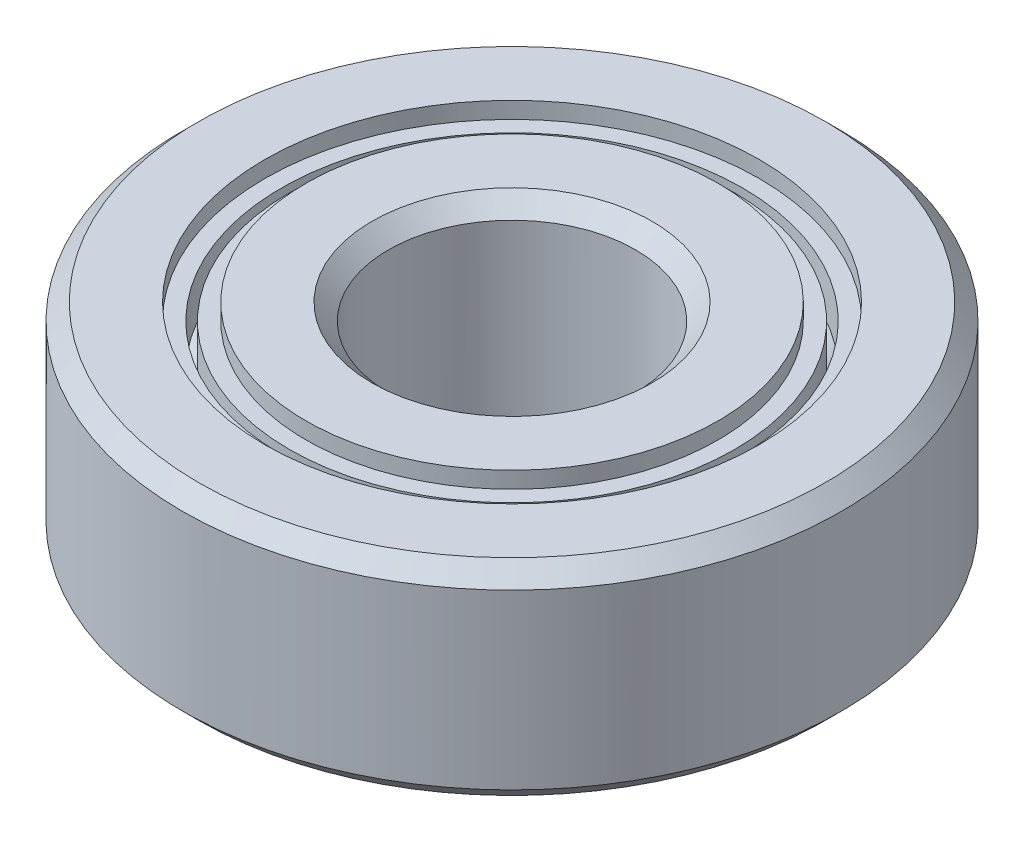
ISO-10303-21;
HEADER;
FILE_DESCRIPTION(('STEP AP214'),'2;1');
FILE_NAME('part.step','',(''),(''),'','','');
FILE_SCHEMA(('AUTOMOTIVE_DESIGN { 1 0 10303 214 1 1 1 1 }'));
ENDSEC;
DATA;
#1=APPLICATION_CONTEXT('core data for automotive mechanical design processes');
#2=APPLICATION_PROTOCOL_DEFINITION('international standard','automotive_design',2000,#1);
#3=PRODUCT_CONTEXT('',#1,'mechanical');
#4=PRODUCT('Part','Part','',(#3));
#5=PRODUCT_RELATED_PRODUCT_CATEGORY('part','',(#4));
#6=PRODUCT_DEFINITION_FORMATION('','',#4);
#7=PRODUCT_DEFINITION_CONTEXT('part definition',#1,'design');
#8=PRODUCT_DEFINITION('design','',#6,#7);
#9=PRODUCT_DEFINITION_SHAPE('','',#8);
#10=(LENGTH_UNIT() NAMED_UNIT(*) SI_UNIT(.MILLI.,.METRE.));
#11=(NAMED_UNIT(*) PLANE_ANGLE_UNIT() SI_UNIT($,.RADIAN.));
#12=(NAMED_UNIT(*) SI_UNIT($,.STERADIAN.) SOLID_ANGLE_UNIT());
#13=UNCERTAINTY_MEASURE_WITH_UNIT(LENGTH_MEASURE(1.E-05),#10,'distance_accuracy_value','');
#14=(GEOMETRIC_REPRESENTATION_CONTEXT(3) GLOBAL_UNCERTAINTY_ASSIGNED_CONTEXT((#13)) GLOBAL_UNIT_ASSIGNED_CONTEXT((#10,
#11,#12)) REPRESENTATION_CONTEXT('',''));
#15=CARTESIAN_POINT('',(0.,0.,0.));
#16=DIRECTION('',(0.,0.,1.));
#17=DIRECTION('',(1.,0.,0.));
#18=AXIS2_PLACEMENT_3D('',#15,#16,#17);
#19=CARTESIAN_POINT('',(2.56429863086199,1.,-0.993414582014637));
#20=DIRECTION('',(0.,-1.,0.));
#21=DIRECTION('',(-0.932472229404361,0.,0.361241666187141));
#22=AXIS2_PLACEMENT_3D('',#19,#20,#21);
#23=SPHERICAL_SURFACE('',#22,0.5);
#24=CARTESIAN_POINT('',(2.56429863086199,0.5,-0.993414582014637));
#25=VERTEX_POINT('',#24);
#26=VERTEX_LOOP('',#25);
#27=FACE_BOUND('',#26,.T.);
#28=ADVANCED_FACE('F36',(#27),#23,.T.);
#29=CLOSED_SHELL('',(#28));
#30=MANIFOLD_SOLID_BREP('B2',#29);
#31=CARTESIAN_POINT('',(2.03227452235684,1.,-1.85266302002801));
#32=DIRECTION('',(0.,-1.,0.));
#33=DIRECTION('',(-0.739008917220668,0.,0.673695643646548));
#34=AXIS2_PLACEMENT_3D('',#31,#32,#33);
#35=SPHERICAL_SURFACE('',#34,0.5);
#36=CARTESIAN_POINT('',(2.03227452235684,0.5,-1.85266302002801));
#37=VERTEX_POINT('',#36);
#38=VERTEX_LOOP('',#37);
#39=FACE_BOUND('',#38,.T.);
#40=ADVANCED_FACE('F55',(#39),#35,.T.);
#41=CLOSED_SHELL('',(#40));
#42=MANIFOLD_SOLID_BREP('B6',#41);
#43=CARTESIAN_POINT('',(1.22578047838551,1.,-2.46169905122641));
#44=DIRECTION('',(0.,-1.,0.));
#45=DIRECTION('',(-0.445738355776549,0.,0.895163291355057));
#46=AXIS2_PLACEMENT_3D('',#43,#44,#45);
#47=SPHERICAL_SURFACE('',#46,0.5);
#48=CARTESIAN_POINT('',(1.22578047838551,0.5,-2.46169905122641));
#49=VERTEX_POINT('',#48);
#50=VERTEX_LOOP('',#49);
#51=FACE_BOUND('',#50,.T.);
#52=ADVANCED_FACE('F74',(#51),#47,.T.);
#53=CLOSED_SHELL('',(#52));
#54=MANIFOLD_SOLID_BREP('B32',#53);
#55=CARTESIAN_POINT('',(0.253737988524111,1.,-2.73826898481134));
#56=DIRECTION('',(0.,-1.,0.));
#57=DIRECTION('',(-0.092268359463313,0.,0.995734176295033));
#58=AXIS2_PLACEMENT_3D('',#55,#56,#57);
#59=SPHERICAL_SURFACE('',#58,0.5);
#60=CARTESIAN_POINT('',(0.253737988524111,0.5,-2.73826898481134));
#61=VERTEX_POINT('',#60);
#62=VERTEX_LOOP('',#61);
#63=FACE_BOUND('',#62,.T.);
#64=ADVANCED_FACE('F93',(#63),#59,.T.);
#65=CLOSED_SHELL('',(#64));
#66=MANIFOLD_SOLID_BREP('B51',#65);
#67=CARTESIAN_POINT('',(-0.7525732226982,1.,-2.64502051872526));
#68=DIRECTION('',(0.,-1.,0.));
#69=DIRECTION('',(0.273662990072073,0.,0.961825643172822));
#70=AXIS2_PLACEMENT_3D('',#67,#68,#69);
#71=SPHERICAL_SURFACE('',#70,0.5);
#72=CARTESIAN_POINT('',(-0.7525732226982,0.5,-2.64502051872526));
#73=VERTEX_POINT('',#72);
#74=VERTEX_LOOP('',#73);
#75=FACE_BOUND('',#74,.T.);
#76=ADVANCED_FACE('F112',(#75),#71,.T.);
#77=CLOSED_SHELL('',(#76));
#78=MANIFOLD_SOLID_BREP('B70',#77);
#79=CARTESIAN_POINT('',(-1.65724525004294,1.,-2.19454737502067));
#80=DIRECTION('',(0.,-1.,0.));
#81=DIRECTION('',(0.602634636379249,0.,0.798017227280245));
#82=AXIS2_PLACEMENT_3D('',#79,#80,#81);
#83=SPHERICAL_SURFACE('',#82,0.5);
#84=CARTESIAN_POINT('',(-1.65724525004294,0.5,-2.19454737502067));
#85=VERTEX_POINT('',#84);
#86=VERTEX_LOOP('',#85);
#87=FACE_BOUND('',#86,.T.);
#88=ADVANCED_FACE('F131',(#87),#83,.T.);
#89=CLOSED_SHELL('',(#88));
#90=MANIFOLD_SOLID_BREP('B89',#89);
#91=CARTESIAN_POINT('',(-2.33809712325643,1.,-1.44768844791275));
#92=DIRECTION('',(0.,-1.,0.));
#93=DIRECTION('',(0.85021713572961,0.,0.526432162877363));
#94=AXIS2_PLACEMENT_3D('',#91,#92,#93);
#95=SPHERICAL_SURFACE('',#94,0.5);
#96=CARTESIAN_POINT('',(-2.33809712325643,0.5,-1.44768844791275));
#97=VERTEX_POINT('',#96);
#98=VERTEX_LOOP('',#97);
#99=FACE_BOUND('',#98,.T.);
#100=ADVANCED_FACE('F150',(#99),#95,.T.);
#101=CLOSED_SHELL('',(#100));
#102=MANIFOLD_SOLID_BREP('B108',#101);
#103=CARTESIAN_POINT('',(-2.70317602413073,1.,-0.505311173995588));
#104=DIRECTION('',(0.,-1.,0.));
#105=DIRECTION('',(0.9829730996839,0.,0.183749517816578));
#106=AXIS2_PLACEMENT_3D('',#103,#104,#105);
#107=SPHERICAL_SURFACE('',#106,0.5);
#108=CARTESIAN_POINT('',(-2.70317602413073,0.5,-0.505311173995588));
#109=VERTEX_POINT('',#108);
#110=VERTEX_LOOP('',#109);
#111=FACE_BOUND('',#110,.T.);
#112=ADVANCED_FACE('F169',(#111),#107,.T.);
#113=CLOSED_SHELL('',(#112));
#114=MANIFOLD_SOLID_BREP('B127',#113);
#115=CARTESIAN_POINT('',(-2.70317602413073,1.,0.50531117399555));
#116=DIRECTION('',(0.,-1.,0.));
#117=DIRECTION('',(0.982973099683903,0.,-0.183749517816564));
#118=AXIS2_PLACEMENT_3D('',#115,#116,#117);
#119=SPHERICAL_SURFACE('',#118,0.5);
#120=CARTESIAN_POINT('',(-2.70317602413073,0.5,0.50531117399555));
#121=VERTEX_POINT('',#120);
#122=VERTEX_LOOP('',#121);
#123=FACE_BOUND('',#122,.T.);
#124=ADVANCED_FACE('F188',(#123),#119,.T.);
#125=CLOSED_SHELL('',(#124));
#126=MANIFOLD_SOLID_BREP('B146',#125);
#127=CARTESIAN_POINT('',(-2.33809712325645,1.,1.44768844791271));
#128=DIRECTION('',(0.,-1.,0.));
#129=DIRECTION('',(0.850217135729617,0.,-0.526432162877351));
#130=AXIS2_PLACEMENT_3D('',#127,#128,#129);
#131=SPHERICAL_SURFACE('',#130,0.5);
#132=CARTESIAN_POINT('',(-2.33809712325645,0.5,1.44768844791271));
#133=VERTEX_POINT('',#132);
#134=VERTEX_LOOP('',#133);
#135=FACE_BOUND('',#134,.T.);
#136=ADVANCED_FACE('F207',(#135),#131,.T.);
#137=CLOSED_SHELL('',(#136));
#138=MANIFOLD_SOLID_BREP('B165',#137);
#139=CARTESIAN_POINT('',(-1.65724525004297,1.,2.19454737502065));
#140=DIRECTION('',(0.,-1.,0.));
#141=DIRECTION('',(0.602634636379261,0.,-0.798017227280236));
#142=AXIS2_PLACEMENT_3D('',#139,#140,#141);
#143=SPHERICAL_SURFACE('',#142,0.5);
#144=CARTESIAN_POINT('',(-1.65724525004297,0.5,2.19454737502065));
#145=VERTEX_POINT('',#144);
#146=VERTEX_LOOP('',#145);
#147=FACE_BOUND('',#146,.T.);
#148=ADVANCED_FACE('F226',(#147),#143,.T.);
#149=CLOSED_SHELL('',(#148));
#150=MANIFOLD_SOLID_BREP('B184',#149);
#151=CARTESIAN_POINT('',(-0.752573222698239,1.,2.64502051872525));
#152=DIRECTION('',(0.,-1.,0.));
#153=DIRECTION('',(0.273662990072087,0.,-0.961825643172818));
#154=AXIS2_PLACEMENT_3D('',#151,#152,#153);
#155=SPHERICAL_SURFACE('',#154,0.5);
#156=CARTESIAN_POINT('',(-0.752573222698239,0.5,2.64502051872525));
#157=VERTEX_POINT('',#156);
#158=VERTEX_LOOP('',#157);
#159=FACE_BOUND('',#158,.T.);
#160=ADVANCED_FACE('F245',(#159),#155,.T.);
#161=CLOSED_SHELL('',(#160));
#162=MANIFOLD_SOLID_BREP('B203',#161);
#163=CARTESIAN_POINT('',(0.253737988524071,1.,2.73826898481135));
#164=DIRECTION('',(0.,-1.,0.));
#165=DIRECTION('',(-0.0922683594632987,0.,-0.995734176295035));
#166=AXIS2_PLACEMENT_3D('',#163,#164,#165);
#167=SPHERICAL_SURFACE('',#166,0.5);
#168=CARTESIAN_POINT('',(0.253737988524071,0.5,2.73826898481135));
#169=VERTEX_POINT('',#168);
#170=VERTEX_LOOP('',#169);
#171=FACE_BOUND('',#170,.T.);
#172=ADVANCED_FACE('F264',(#171),#167,.T.);
#173=CLOSED_SHELL('',(#172));
#174=MANIFOLD_SOLID_BREP('B222',#173);
#175=CARTESIAN_POINT('',(1.22578047838547,1.,2.46169905122642));
#176=DIRECTION('',(0.,-1.,0.));
#177=DIRECTION('',(-0.445738355776536,0.,-0.895163291355063));
#178=AXIS2_PLACEMENT_3D('',#175,#176,#177);
#179=SPHERICAL_SURFACE('',#178,0.5);
#180=CARTESIAN_POINT('',(1.22578047838547,0.5,2.46169905122642));
#181=VERTEX_POINT('',#180);
#182=VERTEX_LOOP('',#181);
#183=FACE_BOUND('',#182,.T.);
#184=ADVANCED_FACE('F283',(#183),#179,.T.);
#185=CLOSED_SHELL('',(#184));
#186=MANIFOLD_SOLID_BREP('B241',#185);
#187=CARTESIAN_POINT('',(2.03227452235681,1.,1.85266302002804));
#188=DIRECTION('',(0.,-1.,0.));
#189=DIRECTION('',(-0.739008917220658,0.,-0.673695643646558));
#190=AXIS2_PLACEMENT_3D('',#187,#188,#189);
#191=SPHERICAL_SURFACE('',#190,0.5);
#192=CARTESIAN_POINT('',(2.03227452235681,0.5,1.85266302002804));
#193=VERTEX_POINT('',#192);
#194=VERTEX_LOOP('',#193);
#195=FACE_BOUND('',#194,.T.);
#196=ADVANCED_FACE('F302',(#195),#191,.T.);
#197=CLOSED_SHELL('',(#196));
#198=MANIFOLD_SOLID_BREP('B260',#197);
#199=CARTESIAN_POINT('',(2.56429863086198,1.,0.993414582014673));
#200=DIRECTION('',(0.,-1.,0.));
#201=DIRECTION('',(-0.932472229404355,0.,-0.361241666187154));
#202=AXIS2_PLACEMENT_3D('',#199,#200,#201);
#203=SPHERICAL_SURFACE('',#202,0.5);
#204=CARTESIAN_POINT('',(2.56429863086198,0.5,0.993414582014673));
#205=VERTEX_POINT('',#204);
#206=VERTEX_LOOP('',#205);
#207=FACE_BOUND('',#206,.T.);
#208=ADVANCED_FACE('F321',(#207),#203,.T.);
#209=CLOSED_SHELL('',(#208));
#210=MANIFOLD_SOLID_BREP('B279',#209);
#211=CARTESIAN_POINT('',(2.75,1.,0.));
#212=DIRECTION('',(0.,-1.,0.));
#213=DIRECTION('',(-1.,0.,0.));
#214=AXIS2_PLACEMENT_3D('',#211,#212,#213);
#215=SPHERICAL_SURFACE('',#214,0.5);
#216=CARTESIAN_POINT('',(2.75,0.5,0.));
#217=VERTEX_POINT('',#216);
#218=VERTEX_LOOP('',#217);
#219=FACE_BOUND('',#218,.T.);
#220=ADVANCED_FACE('F342',(#219),#215,.T.);
#221=CLOSED_SHELL('',(#220));
#222=MANIFOLD_SOLID_BREP('B298',#221);
#223=CARTESIAN_POINT('',(0.,-0.25,-3.));
#224=DIRECTION('',(0.,-1.,0.));
#225=DIRECTION('',(0.,0.,-1.));
#226=AXIS2_PLACEMENT_3D('',#223,#224,#225);
#227=PLANE('',#226);
#228=CARTESIAN_POINT('',(0.,-0.25,0.));
#229=DIRECTION('',(0.,-1.,0.));
#230=DIRECTION('',(0.,0.,-1.));
#231=AXIS2_PLACEMENT_3D('',#228,#229,#230);
#232=CIRCLE('',#231,3.8);
#233=CARTESIAN_POINT('',(0.,-0.25,-3.8));
#234=VERTEX_POINT('',#233);
#235=EDGE_CURVE('E377',#234,#234,#232,.T.);
#236=ORIENTED_EDGE('',*,*,#235,.T.);
#237=EDGE_LOOP('',(#236));
#238=FACE_BOUND('',#237,.T.);
#239=CARTESIAN_POINT('',(0.,-0.250000000000001,0.));
#240=DIRECTION('',(0.,-1.,0.));
#241=DIRECTION('',(0.,0.,-1.));
#242=AXIS2_PLACEMENT_3D('',#239,#240,#241);
#243=CIRCLE('',#242,3.);
#244=CARTESIAN_POINT('',(0.,-0.250000000000001,-3.));
#245=VERTEX_POINT('',#244);
#246=EDGE_CURVE('E403',#245,#245,#243,.T.);
#247=ORIENTED_EDGE('',*,*,#246,.F.);
#248=EDGE_LOOP('',(#247));
#249=FACE_BOUND('',#248,.T.);
#250=ADVANCED_FACE('F362',(#238,#249),#227,.T.);
#251=CARTESIAN_POINT('',(0.,0.,0.));
#252=DIRECTION('',(0.,-1.,0.));
#253=DIRECTION('',(0.,0.,-1.));
#254=AXIS2_PLACEMENT_3D('',#251,#252,#253);
#255=CYLINDRICAL_SURFACE('',#254,4.);
#256=CARTESIAN_POINT('',(0.,-0.0499999999999982,0.));
#257=DIRECTION('',(0.,-1.,0.));
#258=DIRECTION('',(0.,0.,-1.));
#259=AXIS2_PLACEMENT_3D('',#256,#257,#258);
#260=CIRCLE('',#259,4.);
#261=CARTESIAN_POINT('',(0.,-0.0499999999999982,-4.));
#262=VERTEX_POINT('',#261);
#263=EDGE_CURVE('E369',#262,#262,#260,.F.);
#264=ORIENTED_EDGE('',*,*,#263,.T.);
#265=EDGE_LOOP('',(#264));
#266=FACE_BOUND('',#265,.T.);
#267=CARTESIAN_POINT('',(0.,2.05,0.));
#268=DIRECTION('',(0.,1.,0.));
#269=DIRECTION('',(0.,0.,1.));
#270=AXIS2_PLACEMENT_3D('',#267,#268,#269);
#271=CIRCLE('',#270,4.);
#272=CARTESIAN_POINT('',(0.,2.05,4.));
#273=VERTEX_POINT('',#272);
#274=EDGE_CURVE('E373',#273,#273,#271,.F.);
#275=ORIENTED_EDGE('',*,*,#274,.T.);
#276=EDGE_LOOP('',(#275));
#277=FACE_BOUND('',#276,.T.);
#278=ADVANCED_FACE('F411',(#266,#277),#255,.T.);
#279=CARTESIAN_POINT('',(0.,2.25,-4.));
#280=DIRECTION('',(0.,1.,0.));
#281=DIRECTION('',(0.,0.,1.));
#282=AXIS2_PLACEMENT_3D('',#279,#280,#281);
#283=PLANE('',#282);
#284=CARTESIAN_POINT('',(0.,2.25,0.));
#285=DIRECTION('',(0.,1.,0.));
#286=DIRECTION('',(0.,0.,1.));
#287=AXIS2_PLACEMENT_3D('',#284,#285,#286);
#288=CIRCLE('',#287,3.8);
#289=CARTESIAN_POINT('',(0.,2.25,3.8));
#290=VERTEX_POINT('',#289);
#291=EDGE_CURVE('E341',#290,#290,#288,.T.);
#292=ORIENTED_EDGE('',*,*,#291,.T.);
#293=EDGE_LOOP('',(#292));
#294=FACE_BOUND('',#293,.T.);
#295=CARTESIAN_POINT('',(0.,2.25,0.));
#296=DIRECTION('',(0.,-1.,0.));
#297=DIRECTION('',(0.,0.,-1.));
#298=AXIS2_PLACEMENT_3D('',#295,#296,#297);
#299=CIRCLE('',#298,3.);
#300=CARTESIAN_POINT('',(0.,2.25,-3.));
#301=VERTEX_POINT('',#300);
#302=EDGE_CURVE('E382',#301,#301,#299,.T.);
#303=ORIENTED_EDGE('',*,*,#302,.T.);
#304=EDGE_LOOP('',(#303));
#305=FACE_BOUND('',#304,.T.);
#306=ADVANCED_FACE('F417',(#294,#305),#283,.T.);
#307=CARTESIAN_POINT('',(0.,0.,0.));
#308=DIRECTION('',(0.,-1.,0.));
#309=DIRECTION('',(0.,0.,-1.));
#310=AXIS2_PLACEMENT_3D('',#307,#308,#309);
#311=CYLINDRICAL_SURFACE('',#310,3.);
#312=CARTESIAN_POINT('',(0.,2.04945428736246,0.));
#313=DIRECTION('',(0.,-1.,0.));
#314=DIRECTION('',(0.,0.,-1.));
#315=AXIS2_PLACEMENT_3D('',#312,#313,#314);
#316=CIRCLE('',#315,3.);
#317=CARTESIAN_POINT('',(0.,2.04945428736246,-3.));
#318=VERTEX_POINT('',#317);
#319=EDGE_CURVE('E385',#318,#318,#316,.T.);
#320=ORIENTED_EDGE('',*,*,#319,.T.);
#321=EDGE_LOOP('',(#320));
#322=FACE_BOUND('',#321,.T.);
#323=ORIENTED_EDGE('',*,*,#302,.F.);
#324=EDGE_LOOP('',(#323));
#325=FACE_BOUND('',#324,.T.);
#326=ADVANCED_FACE('F453',(#322,#325),#311,.F.);
#327=CARTESIAN_POINT('',(0.,2.04945428736246,-2.8));
#328=DIRECTION('',(0.,1.,0.));
#329=DIRECTION('',(0.,0.,1.));
#330=AXIS2_PLACEMENT_3D('',#327,#328,#329);
#331=PLANE('',#330);
#332=CARTESIAN_POINT('',(0.,2.04945428736246,0.));
#333=DIRECTION('',(0.,-1.,0.));
#334=DIRECTION('',(0.,0.,-1.));
#335=AXIS2_PLACEMENT_3D('',#332,#333,#334);
#336=CIRCLE('',#335,2.8);
#337=CARTESIAN_POINT('',(0.,2.04945428736246,-2.8));
#338=VERTEX_POINT('',#337);
#339=EDGE_CURVE('E388',#338,#338,#336,.T.);
#340=ORIENTED_EDGE('',*,*,#339,.T.);
#341=EDGE_LOOP('',(#340));
#342=FACE_BOUND('',#341,.T.);
#343=ORIENTED_EDGE('',*,*,#319,.F.);
#344=EDGE_LOOP('',(#343));
#345=FACE_BOUND('',#344,.T.);
#346=ADVANCED_FACE('F449',(#342,#345),#331,.T.);
#347=CARTESIAN_POINT('',(0.,0.,0.));
#348=DIRECTION('',(0.,-1.,0.));
#349=DIRECTION('',(0.,0.,-1.));
#350=AXIS2_PLACEMENT_3D('',#347,#348,#349);
#351=CYLINDRICAL_SURFACE('',#350,2.8);
#352=CARTESIAN_POINT('',(0.,1.52261362400917,0.));
#353=DIRECTION('',(0.,-1.,0.));
#354=DIRECTION('',(0.,0.,-1.));
#355=AXIS2_PLACEMENT_3D('',#352,#353,#354);
#356=CIRCLE('',#355,2.8);
#357=CARTESIAN_POINT('',(0.,1.52261362400917,-2.8));
#358=VERTEX_POINT('',#357);
#359=EDGE_CURVE('E391',#358,#358,#356,.T.);
#360=ORIENTED_EDGE('',*,*,#359,.T.);
#361=EDGE_LOOP('',(#360));
#362=FACE_BOUND('',#361,.T.);
#363=ORIENTED_EDGE('',*,*,#339,.F.);
#364=EDGE_LOOP('',(#363));
#365=FACE_BOUND('',#364,.T.);
#366=ADVANCED_FACE('F445',(#362,#365),#351,.F.);
#367=CARTESIAN_POINT('',(0.,1.,0.));
#368=DIRECTION('',(0.,-1.,0.));
#369=DIRECTION('',(0.,0.,-1.));
#370=AXIS2_PLACEMENT_3D('',#367,#368,#369);
#371=TOROIDAL_SURFACE('',#370,2.75,0.525);
#372=CARTESIAN_POINT('',(0.,0.477386375990828,0.));
#373=DIRECTION('',(0.,-1.,0.));
#374=DIRECTION('',(0.,0.,-1.));
#375=AXIS2_PLACEMENT_3D('',#372,#373,#374);
#376=CIRCLE('',#375,2.8);
#377=CARTESIAN_POINT('',(0.,0.477386375990828,-2.8));
#378=VERTEX_POINT('',#377);
#379=EDGE_CURVE('E394',#378,#378,#376,.T.);
#380=ORIENTED_EDGE('',*,*,#379,.T.);
#381=EDGE_LOOP('',(#380));
#382=FACE_BOUND('',#381,.T.);
#383=ORIENTED_EDGE('',*,*,#359,.F.);
#384=EDGE_LOOP('',(#383));
#385=FACE_BOUND('',#384,.T.);
#386=ADVANCED_FACE('F441',(#382,#385),#371,.F.);
#387=CARTESIAN_POINT('',(0.,0.,0.));
#388=DIRECTION('',(0.,-1.,0.));
#389=DIRECTION('',(0.,0.,-1.));
#390=AXIS2_PLACEMENT_3D('',#387,#388,#389);
#391=CYLINDRICAL_SURFACE('',#390,2.8);
#392=CARTESIAN_POINT('',(0.,-0.0494542873624576,0.));
#393=DIRECTION('',(0.,-1.,0.));
#394=DIRECTION('',(0.,0.,-1.));
#395=AXIS2_PLACEMENT_3D('',#392,#393,#394);
#396=CIRCLE('',#395,2.8);
#397=CARTESIAN_POINT('',(0.,-0.0494542873624576,-2.8));
#398=VERTEX_POINT('',#397);
#399=EDGE_CURVE('E397',#398,#398,#396,.T.);
#400=ORIENTED_EDGE('',*,*,#399,.T.);
#401=EDGE_LOOP('',(#400));
#402=FACE_BOUND('',#401,.T.);
#403=ORIENTED_EDGE('',*,*,#379,.F.);
#404=EDGE_LOOP('',(#403));
#405=FACE_BOUND('',#404,.T.);
#406=ADVANCED_FACE('F435',(#402,#405),#391,.F.);
#407=CARTESIAN_POINT('',(0.,-0.0494542873624574,-2.8));
#408=DIRECTION('',(0.,-1.,0.));
#409=DIRECTION('',(0.,0.,-1.));
#410=AXIS2_PLACEMENT_3D('',#407,#408,#409);
#411=PLANE('',#410);
#412=CARTESIAN_POINT('',(0.,-0.0494542873624572,0.));
#413=DIRECTION('',(0.,-1.,0.));
#414=DIRECTION('',(0.,0.,-1.));
#415=AXIS2_PLACEMENT_3D('',#412,#413,#414);
#416=CIRCLE('',#415,3.);
#417=CARTESIAN_POINT('',(0.,-0.0494542873624572,-3.));
#418=VERTEX_POINT('',#417);
#419=EDGE_CURVE('E400',#418,#418,#416,.T.);
#420=ORIENTED_EDGE('',*,*,#419,.T.);
#421=EDGE_LOOP('',(#420));
#422=FACE_BOUND('',#421,.T.);
#423=ORIENTED_EDGE('',*,*,#399,.F.);
#424=EDGE_LOOP('',(#423));
#425=FACE_BOUND('',#424,.T.);
#426=ADVANCED_FACE('F428',(#422,#425),#411,.T.);
#427=CARTESIAN_POINT('',(0.,0.,0.));
#428=DIRECTION('',(0.,-1.,0.));
#429=DIRECTION('',(0.,0.,-1.));
#430=AXIS2_PLACEMENT_3D('',#427,#428,#429);
#431=CYLINDRICAL_SURFACE('',#430,3.);
#432=ORIENTED_EDGE('',*,*,#246,.T.);
#433=EDGE_LOOP('',(#432));
#434=FACE_BOUND('',#433,.T.);
#435=ORIENTED_EDGE('',*,*,#419,.F.);
#436=EDGE_LOOP('',(#435));
#437=FACE_BOUND('',#436,.T.);
#438=ADVANCED_FACE('F407',(#434,#437),#431,.F.);
#439=CARTESIAN_POINT('',(0.,-0.25,0.));
#440=DIRECTION('',(0.,1.,0.));
#441=DIRECTION('',(0.,0.,1.));
#442=AXIS2_PLACEMENT_3D('',#439,#440,#441);
#443=CONICAL_SURFACE('',#442,3.8,0.785398163397448);
#444=ORIENTED_EDGE('',*,*,#263,.F.);
#445=EDGE_LOOP('',(#444));
#446=FACE_BOUND('',#445,.T.);
#447=ORIENTED_EDGE('',*,*,#235,.F.);
#448=EDGE_LOOP('',(#447));
#449=FACE_BOUND('',#448,.T.);
#450=ADVANCED_FACE('F420',(#446,#449),#443,.T.);
#451=CARTESIAN_POINT('',(0.,2.05,0.));
#452=DIRECTION('',(0.,-1.,0.));
#453=DIRECTION('',(0.,0.,-1.));
#454=AXIS2_PLACEMENT_3D('',#451,#452,#453);
#455=CONICAL_SURFACE('',#454,4.,0.785398163397448);
#456=ORIENTED_EDGE('',*,*,#291,.F.);
#457=EDGE_LOOP('',(#456));
#458=FACE_BOUND('',#457,.T.);
#459=ORIENTED_EDGE('',*,*,#274,.F.);
#460=EDGE_LOOP('',(#459));
#461=FACE_BOUND('',#460,.T.);
#462=ADVANCED_FACE('F364',(#458,#461),#455,.T.);
#463=CLOSED_SHELL('',(#250,#278,#306,#326,#346,#366,#386,#406,#426,#438,#450,#462));
#464=MANIFOLD_SOLID_BREP('B317',#463);
#465=CARTESIAN_POINT('',(0.,0.,0.));
#466=DIRECTION('',(0.,-1.,0.));
#467=DIRECTION('',(0.,0.,-1.));
#468=AXIS2_PLACEMENT_3D('',#465,#466,#467);
#469=CYLINDRICAL_SURFACE('',#468,1.5);
#470=CARTESIAN_POINT('',(0.,2.05,0.));
#471=DIRECTION('',(0.,1.,0.));
#472=DIRECTION('',(0.,0.,1.));
#473=AXIS2_PLACEMENT_3D('',#470,#471,#472);
#474=CIRCLE('',#473,1.5);
#475=CARTESIAN_POINT('',(0.,2.05,1.5));
#476=VERTEX_POINT('',#475);
#477=EDGE_CURVE('E551',#476,#476,#474,.T.);
#478=ORIENTED_EDGE('',*,*,#477,.T.);
#479=EDGE_LOOP('',(#478));
#480=FACE_BOUND('',#479,.T.);
#481=CARTESIAN_POINT('',(0.,-0.0499999999999991,0.));
#482=DIRECTION('',(0.,-1.,0.));
#483=DIRECTION('',(0.,0.,-1.));
#484=AXIS2_PLACEMENT_3D('',#481,#482,#483);
#485=CIRCLE('',#484,1.5);
#486=CARTESIAN_POINT('',(0.,-0.0499999999999991,-1.5));
#487=VERTEX_POINT('',#486);
#488=EDGE_CURVE('E555',#487,#487,#485,.T.);
#489=ORIENTED_EDGE('',*,*,#488,.T.);
#490=EDGE_LOOP('',(#489));
#491=FACE_BOUND('',#490,.T.);
#492=ADVANCED_FACE('F544',(#480,#491),#469,.F.);
#493=CARTESIAN_POINT('',(0.,-0.25,-1.5));
#494=DIRECTION('',(0.,-1.,0.));
#495=DIRECTION('',(0.,0.,-1.));
#496=AXIS2_PLACEMENT_3D('',#493,#494,#495);
#497=PLANE('',#496);
#498=CARTESIAN_POINT('',(0.,-0.25,0.));
#499=DIRECTION('',(0.,-1.,0.));
#500=DIRECTION('',(0.,0.,-1.));
#501=AXIS2_PLACEMENT_3D('',#498,#499,#500);
#502=CIRCLE('',#501,1.7);
#503=CARTESIAN_POINT('',(0.,-0.25,-1.7));
#504=VERTEX_POINT('',#503);
#505=EDGE_CURVE('E361',#504,#504,#502,.F.);
#506=ORIENTED_EDGE('',*,*,#505,.T.);
#507=EDGE_LOOP('',(#506));
#508=FACE_BOUND('',#507,.T.);
#509=CARTESIAN_POINT('',(0.,-0.250000000000001,0.));
#510=DIRECTION('',(0.,-1.,0.));
#511=DIRECTION('',(0.,0.,-1.));
#512=AXIS2_PLACEMENT_3D('',#509,#510,#511);
#513=CIRCLE('',#512,2.5);
#514=CARTESIAN_POINT('',(0.,-0.250000000000001,-2.5));
#515=VERTEX_POINT('',#514);
#516=EDGE_CURVE('E564',#515,#515,#513,.T.);
#517=ORIENTED_EDGE('',*,*,#516,.T.);
#518=EDGE_LOOP('',(#517));
#519=FACE_BOUND('',#518,.T.);
#520=ADVANCED_FACE('F605',(#508,#519),#497,.T.);
#521=CARTESIAN_POINT('',(0.,0.,0.));
#522=DIRECTION('',(0.,-1.,0.));
#523=DIRECTION('',(0.,0.,-1.));
#524=AXIS2_PLACEMENT_3D('',#521,#522,#523);
#525=CYLINDRICAL_SURFACE('',#524,2.5);
#526=CARTESIAN_POINT('',(0.,-0.0494542873624576,0.));
#527=DIRECTION('',(0.,-1.,0.));
#528=DIRECTION('',(0.,0.,-1.));
#529=AXIS2_PLACEMENT_3D('',#526,#527,#528);
#530=CIRCLE('',#529,2.5);
#531=CARTESIAN_POINT('',(0.,-0.0494542873624576,-2.5));
#532=VERTEX_POINT('',#531);
#533=EDGE_CURVE('E567',#532,#532,#530,.T.);
#534=ORIENTED_EDGE('',*,*,#533,.T.);
#535=EDGE_LOOP('',(#534));
#536=FACE_BOUND('',#535,.T.);
#537=ORIENTED_EDGE('',*,*,#516,.F.);
#538=EDGE_LOOP('',(#537));
#539=FACE_BOUND('',#538,.T.);
#540=ADVANCED_FACE('F610',(#536,#539),#525,.T.);
#541=CARTESIAN_POINT('',(0.,-0.0494542873624576,-2.5));
#542=DIRECTION('',(0.,-1.,0.));
#543=DIRECTION('',(0.,0.,-1.));
#544=AXIS2_PLACEMENT_3D('',#541,#542,#543);
#545=PLANE('',#544);
#546=CARTESIAN_POINT('',(0.,-0.0494542873624576,0.));
#547=DIRECTION('',(0.,-1.,0.));
#548=DIRECTION('',(0.,0.,-1.));
#549=AXIS2_PLACEMENT_3D('',#546,#547,#548);
#550=CIRCLE('',#549,2.7);
#551=CARTESIAN_POINT('',(0.,-0.0494542873624576,-2.7));
#552=VERTEX_POINT('',#551);
#553=EDGE_CURVE('E570',#552,#552,#550,.T.);
#554=ORIENTED_EDGE('',*,*,#553,.T.);
#555=EDGE_LOOP('',(#554));
#556=FACE_BOUND('',#555,.T.);
#557=ORIENTED_EDGE('',*,*,#533,.F.);
#558=EDGE_LOOP('',(#557));
#559=FACE_BOUND('',#558,.T.);
#560=ADVANCED_FACE('F616',(#556,#559),#545,.T.);
#561=CARTESIAN_POINT('',(0.,0.,0.));
#562=DIRECTION('',(0.,-1.,0.));
#563=DIRECTION('',(0.,0.,-1.));
#564=AXIS2_PLACEMENT_3D('',#561,#562,#563);
#565=CYLINDRICAL_SURFACE('',#564,2.7);
#566=CARTESIAN_POINT('',(0.,0.477386375990828,0.));
#567=DIRECTION('',(0.,-1.,0.));
#568=DIRECTION('',(0.,0.,-1.));
#569=AXIS2_PLACEMENT_3D('',#566,#567,#568);
#570=CIRCLE('',#569,2.7);
#571=CARTESIAN_POINT('',(0.,0.477386375990828,-2.7));
#572=VERTEX_POINT('',#571);
#573=EDGE_CURVE('E573',#572,#572,#570,.T.);
#574=ORIENTED_EDGE('',*,*,#573,.T.);
#575=EDGE_LOOP('',(#574));
#576=FACE_BOUND('',#575,.T.);
#577=ORIENTED_EDGE('',*,*,#553,.F.);
#578=EDGE_LOOP('',(#577));
#579=FACE_BOUND('',#578,.T.);
#580=ADVANCED_FACE('F620',(#576,#579),#565,.T.);
#581=CARTESIAN_POINT('',(0.,1.,0.));
#582=DIRECTION('',(0.,-1.,0.));
#583=DIRECTION('',(0.,0.,-1.));
#584=AXIS2_PLACEMENT_3D('',#581,#582,#583);
#585=TOROIDAL_SURFACE('',#584,2.75,0.525);
#586=CARTESIAN_POINT('',(0.,1.52261362400917,0.));
#587=DIRECTION('',(0.,-1.,0.));
#588=DIRECTION('',(0.,0.,-1.));
#589=AXIS2_PLACEMENT_3D('',#586,#587,#588);
#590=CIRCLE('',#589,2.7);
#591=CARTESIAN_POINT('',(0.,1.52261362400917,-2.7));
#592=VERTEX_POINT('',#591);
#593=EDGE_CURVE('E576',#592,#592,#590,.T.);
#594=ORIENTED_EDGE('',*,*,#593,.T.);
#595=EDGE_LOOP('',(#594));
#596=FACE_BOUND('',#595,.T.);
#597=ORIENTED_EDGE('',*,*,#573,.F.);
#598=EDGE_LOOP('',(#597));
#599=FACE_BOUND('',#598,.T.);
#600=ADVANCED_FACE('F624',(#596,#599),#585,.F.);
#601=CARTESIAN_POINT('',(0.,0.,0.));
#602=DIRECTION('',(0.,-1.,0.));
#603=DIRECTION('',(0.,0.,-1.));
#604=AXIS2_PLACEMENT_3D('',#601,#602,#603);
#605=CYLINDRICAL_SURFACE('',#604,2.7);
#606=CARTESIAN_POINT('',(0.,2.04945428736246,0.));
#607=DIRECTION('',(0.,-1.,0.));
#608=DIRECTION('',(0.,0.,-1.));
#609=AXIS2_PLACEMENT_3D('',#606,#607,#608);
#610=CIRCLE('',#609,2.7);
#611=CARTESIAN_POINT('',(0.,2.04945428736246,-2.7));
#612=VERTEX_POINT('',#611);
#613=EDGE_CURVE('E579',#612,#612,#610,.T.);
#614=ORIENTED_EDGE('',*,*,#613,.T.);
#615=EDGE_LOOP('',(#614));
#616=FACE_BOUND('',#615,.T.);
#617=ORIENTED_EDGE('',*,*,#593,.F.);
#618=EDGE_LOOP('',(#617));
#619=FACE_BOUND('',#618,.T.);
#620=ADVANCED_FACE('F628',(#616,#619),#605,.T.);
#621=CARTESIAN_POINT('',(0.,2.04945428736246,-2.5));
#622=DIRECTION('',(0.,1.,0.));
#623=DIRECTION('',(0.,0.,1.));
#624=AXIS2_PLACEMENT_3D('',#621,#622,#623);
#625=PLANE('',#624);
#626=CARTESIAN_POINT('',(0.,2.04945428736246,0.));
#627=DIRECTION('',(0.,-1.,0.));
#628=DIRECTION('',(0.,0.,-1.));
#629=AXIS2_PLACEMENT_3D('',#626,#627,#628);
#630=CIRCLE('',#629,2.5);
#631=CARTESIAN_POINT('',(0.,2.04945428736246,-2.5));
#632=VERTEX_POINT('',#631);
#633=EDGE_CURVE('E582',#632,#632,#630,.T.);
#634=ORIENTED_EDGE('',*,*,#633,.T.);
#635=EDGE_LOOP('',(#634));
#636=FACE_BOUND('',#635,.T.);
#637=ORIENTED_EDGE('',*,*,#613,.F.);
#638=EDGE_LOOP('',(#637));
#639=FACE_BOUND('',#638,.T.);
#640=ADVANCED_FACE('F602',(#636,#639),#625,.T.);
#641=CARTESIAN_POINT('',(0.,0.,0.));
#642=DIRECTION('',(0.,-1.,0.));
#643=DIRECTION('',(0.,0.,-1.));
#644=AXIS2_PLACEMENT_3D('',#641,#642,#643);
#645=CYLINDRICAL_SURFACE('',#644,2.5);
#646=CARTESIAN_POINT('',(0.,2.25,0.));
#647=DIRECTION('',(0.,-1.,0.));
#648=DIRECTION('',(0.,0.,-1.));
#649=AXIS2_PLACEMENT_3D('',#646,#647,#648);
#650=CIRCLE('',#649,2.5);
#651=CARTESIAN_POINT('',(0.,2.25,-2.5));
#652=VERTEX_POINT('',#651);
#653=EDGE_CURVE('E585',#652,#652,#650,.T.);
#654=ORIENTED_EDGE('',*,*,#653,.T.);
#655=EDGE_LOOP('',(#654));
#656=FACE_BOUND('',#655,.T.);
#657=ORIENTED_EDGE('',*,*,#633,.F.);
#658=EDGE_LOOP('',(#657));
#659=FACE_BOUND('',#658,.T.);
#660=ADVANCED_FACE('F589',(#656,#659),#645,.T.);
#661=CARTESIAN_POINT('',(0.,2.25,-2.5));
#662=DIRECTION('',(0.,1.,0.));
#663=DIRECTION('',(0.,0.,1.));
#664=AXIS2_PLACEMENT_3D('',#661,#662,#663);
#665=PLANE('',#664);
#666=CARTESIAN_POINT('',(0.,2.25,0.));
#667=DIRECTION('',(0.,1.,0.));
#668=DIRECTION('',(0.,0.,1.));
#669=AXIS2_PLACEMENT_3D('',#666,#667,#668);
#670=CIRCLE('',#669,1.7);
#671=CARTESIAN_POINT('',(0.,2.25,1.7));
#672=VERTEX_POINT('',#671);
#673=EDGE_CURVE('E559',#672,#672,#670,.F.);
#674=ORIENTED_EDGE('',*,*,#673,.T.);
#675=EDGE_LOOP('',(#674));
#676=FACE_BOUND('',#675,.T.);
#677=ORIENTED_EDGE('',*,*,#653,.F.);
#678=EDGE_LOOP('',(#677));
#679=FACE_BOUND('',#678,.T.);
#680=ADVANCED_FACE('F592',(#676,#679),#665,.T.);
#681=CARTESIAN_POINT('',(0.,2.25,0.));
#682=DIRECTION('',(0.,1.,0.));
#683=DIRECTION('',(0.,0.,1.));
#684=AXIS2_PLACEMENT_3D('',#681,#682,#683);
#685=CONICAL_SURFACE('',#684,1.7,0.785398163397447);
#686=ORIENTED_EDGE('',*,*,#477,.F.);
#687=EDGE_LOOP('',(#686));
#688=FACE_BOUND('',#687,.T.);
#689=ORIENTED_EDGE('',*,*,#673,.F.);
#690=EDGE_LOOP('',(#689));
#691=FACE_BOUND('',#690,.T.);
#692=ADVANCED_FACE('F594',(#688,#691),#685,.F.);
#693=CARTESIAN_POINT('',(0.,-0.0499999999999991,0.));
#694=DIRECTION('',(0.,-1.,0.));
#695=DIRECTION('',(0.,0.,-1.));
#696=AXIS2_PLACEMENT_3D('',#693,#694,#695);
#697=CONICAL_SURFACE('',#696,1.5,0.78539816339745);
#698=ORIENTED_EDGE('',*,*,#505,.F.);
#699=EDGE_LOOP('',(#698));
#700=FACE_BOUND('',#699,.T.);
#701=ORIENTED_EDGE('',*,*,#488,.F.);
#702=EDGE_LOOP('',(#701));
#703=FACE_BOUND('',#702,.T.);
#704=ADVANCED_FACE('F546',(#700,#703),#697,.F.);
#705=CLOSED_SHELL('',(#492,#520,#540,#560,#580,#600,#620,#640,#660,#680,#692,#704));
#706=MANIFOLD_SOLID_BREP('B336',#705);
#707=ADVANCED_BREP_SHAPE_REPRESENTATION('',(#18,#30,#42,#54,#66,#78,#90,#102,#114,#126,#138,
#150,#162,#174,#186,#198,#210,#222,#464,#706),#14);
#708=SHAPE_DEFINITION_REPRESENTATION(#9,#707);
ENDSEC;
END-ISO-10303-21;
